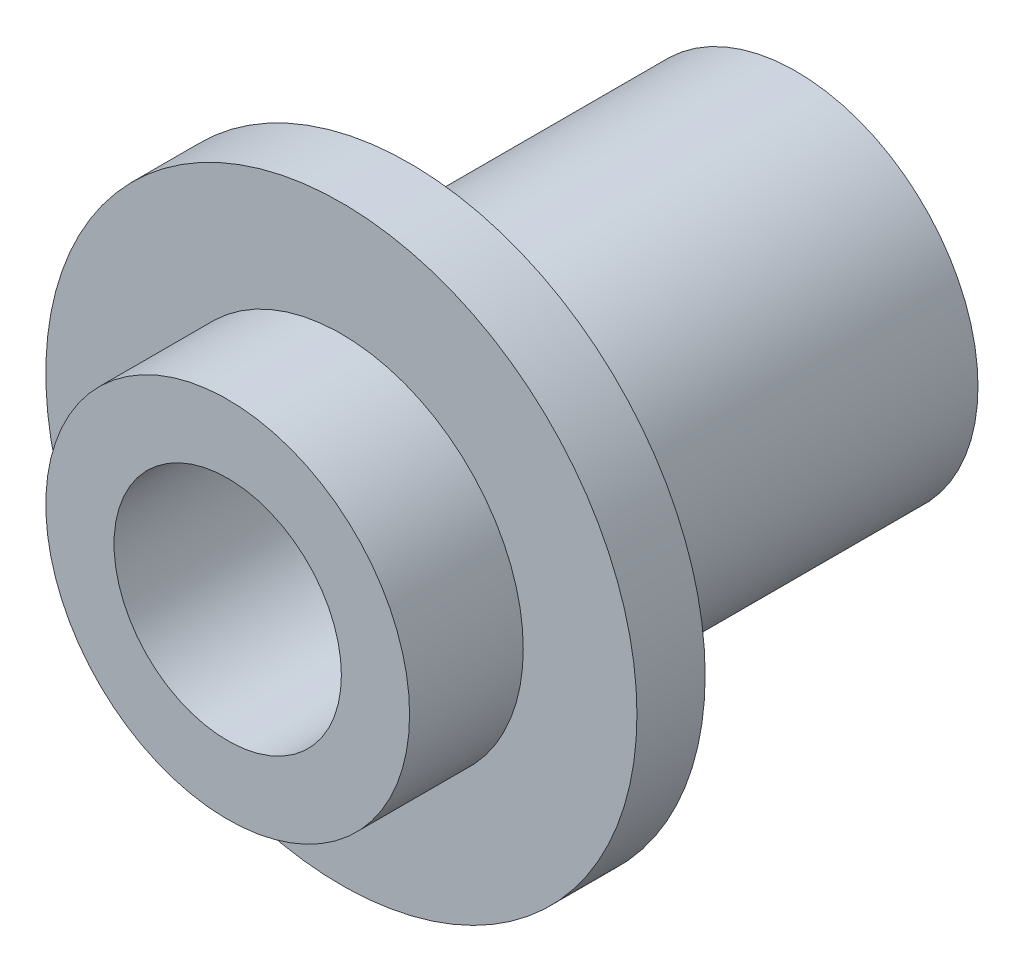
ISO-10303-21;
HEADER;
FILE_DESCRIPTION(('STEP AP214'),'2;1');
FILE_NAME('part.step','',(''),(''),'','','');
FILE_SCHEMA(('AUTOMOTIVE_DESIGN { 1 0 10303 214 1 1 1 1 }'));
ENDSEC;
DATA;
#1=APPLICATION_CONTEXT('core data for automotive mechanical design processes');
#2=APPLICATION_PROTOCOL_DEFINITION('international standard','automotive_design',2000,#1);
#3=PRODUCT_CONTEXT('',#1,'mechanical');
#4=PRODUCT('Part','Part','',(#3));
#5=PRODUCT_RELATED_PRODUCT_CATEGORY('part','',(#4));
#6=PRODUCT_DEFINITION_FORMATION('','',#4);
#7=PRODUCT_DEFINITION_CONTEXT('part definition',#1,'design');
#8=PRODUCT_DEFINITION('design','',#6,#7);
#9=PRODUCT_DEFINITION_SHAPE('','',#8);
#10=(LENGTH_UNIT() NAMED_UNIT(*) SI_UNIT(.MILLI.,.METRE.));
#11=(NAMED_UNIT(*) PLANE_ANGLE_UNIT() SI_UNIT($,.RADIAN.));
#12=(NAMED_UNIT(*) SI_UNIT($,.STERADIAN.) SOLID_ANGLE_UNIT());
#13=UNCERTAINTY_MEASURE_WITH_UNIT(LENGTH_MEASURE(1.E-05),#10,'distance_accuracy_value','');
#14=(GEOMETRIC_REPRESENTATION_CONTEXT(3) GLOBAL_UNCERTAINTY_ASSIGNED_CONTEXT((#13)) GLOBAL_UNIT_ASSIGNED_CONTEXT((#10,
#11,#12)) REPRESENTATION_CONTEXT('',''));
#15=CARTESIAN_POINT('',(0.,0.,0.));
#16=DIRECTION('',(0.,0.,1.));
#17=DIRECTION('',(1.,0.,0.));
#18=AXIS2_PLACEMENT_3D('',#15,#16,#17);
#19=CARTESIAN_POINT('',(0.,0.,30.));
#20=DIRECTION('',(0.,0.,1.));
#21=DIRECTION('',(1.,0.,0.));
#22=AXIS2_PLACEMENT_3D('',#19,#20,#21);
#23=CYLINDRICAL_SURFACE('',#22,5.);
#24=CARTESIAN_POINT('',(0.,0.,-20.));
#25=DIRECTION('',(0.,0.,1.));
#26=DIRECTION('',(1.,0.,0.));
#27=AXIS2_PLACEMENT_3D('',#24,#25,#26);
#28=CIRCLE('',#27,5.);
#29=CARTESIAN_POINT('',(5.,0.,-20.));
#30=VERTEX_POINT('',#29);
#31=EDGE_CURVE('E64',#30,#30,#28,.T.);
#32=ORIENTED_EDGE('',*,*,#31,.F.);
#33=EDGE_LOOP('',(#32));
#34=FACE_BOUND('',#33,.T.);
#35=CARTESIAN_POINT('',(0.,0.,5.));
#36=DIRECTION('',(0.,0.,1.));
#37=DIRECTION('',(1.,0.,0.));
#38=AXIS2_PLACEMENT_3D('',#35,#36,#37);
#39=CIRCLE('',#38,5.);
#40=CARTESIAN_POINT('',(5.,0.,5.));
#41=VERTEX_POINT('',#40);
#42=EDGE_CURVE('E10',#41,#41,#39,.T.);
#43=ORIENTED_EDGE('',*,*,#42,.T.);
#44=EDGE_LOOP('',(#43));
#45=FACE_BOUND('',#44,.T.);
#46=ADVANCED_FACE('F36',(#34,#45),#23,.F.);
#47=CARTESIAN_POINT('',(0.,5.,5.));
#48=DIRECTION('',(0.,0.,-1.));
#49=DIRECTION('',(-1.,0.,0.));
#50=AXIS2_PLACEMENT_3D('',#47,#48,#49);
#51=PLANE('',#50);
#52=ORIENTED_EDGE('',*,*,#42,.F.);
#53=EDGE_LOOP('',(#52));
#54=FACE_BOUND('',#53,.T.);
#55=CARTESIAN_POINT('',(0.,0.,5.));
#56=DIRECTION('',(0.,0.,1.));
#57=DIRECTION('',(1.,0.,0.));
#58=AXIS2_PLACEMENT_3D('',#55,#56,#57);
#59=CIRCLE('',#58,8.);
#60=CARTESIAN_POINT('',(8.,0.,5.));
#61=VERTEX_POINT('',#60);
#62=EDGE_CURVE('E42',#61,#61,#59,.T.);
#63=ORIENTED_EDGE('',*,*,#62,.T.);
#64=EDGE_LOOP('',(#63));
#65=FACE_BOUND('',#64,.T.);
#66=ADVANCED_FACE('F71',(#54,#65),#51,.F.);
#67=CARTESIAN_POINT('',(0.,0.,30.));
#68=DIRECTION('',(0.,0.,1.));
#69=DIRECTION('',(1.,0.,0.));
#70=AXIS2_PLACEMENT_3D('',#67,#68,#69);
#71=CYLINDRICAL_SURFACE('',#70,8.);
#72=ORIENTED_EDGE('',*,*,#62,.F.);
#73=EDGE_LOOP('',(#72));
#74=FACE_BOUND('',#73,.T.);
#75=CARTESIAN_POINT('',(0.,0.,0.));
#76=DIRECTION('',(0.,0.,1.));
#77=DIRECTION('',(1.,0.,0.));
#78=AXIS2_PLACEMENT_3D('',#75,#76,#77);
#79=CIRCLE('',#78,8.);
#80=CARTESIAN_POINT('',(8.,0.,0.));
#81=VERTEX_POINT('',#80);
#82=EDGE_CURVE('E46',#81,#81,#79,.T.);
#83=ORIENTED_EDGE('',*,*,#82,.T.);
#84=EDGE_LOOP('',(#83));
#85=FACE_BOUND('',#84,.T.);
#86=ADVANCED_FACE('F75',(#74,#85),#71,.T.);
#87=CARTESIAN_POINT('',(0.,8.,0.));
#88=DIRECTION('',(0.,0.,-1.));
#89=DIRECTION('',(-1.,0.,0.));
#90=AXIS2_PLACEMENT_3D('',#87,#88,#89);
#91=PLANE('',#90);
#92=ORIENTED_EDGE('',*,*,#82,.F.);
#93=EDGE_LOOP('',(#92));
#94=FACE_BOUND('',#93,.T.);
#95=CARTESIAN_POINT('',(0.,0.,0.));
#96=DIRECTION('',(0.,0.,1.));
#97=DIRECTION('',(1.,0.,0.));
#98=AXIS2_PLACEMENT_3D('',#95,#96,#97);
#99=CIRCLE('',#98,13.);
#100=CARTESIAN_POINT('',(13.,0.,0.));
#101=VERTEX_POINT('',#100);
#102=EDGE_CURVE('E50',#101,#101,#99,.T.);
#103=ORIENTED_EDGE('',*,*,#102,.T.);
#104=EDGE_LOOP('',(#103));
#105=FACE_BOUND('',#104,.T.);
#106=ADVANCED_FACE('F80',(#94,#105),#91,.F.);
#107=CARTESIAN_POINT('',(0.,0.,30.));
#108=DIRECTION('',(0.,0.,1.));
#109=DIRECTION('',(1.,0.,0.));
#110=AXIS2_PLACEMENT_3D('',#107,#108,#109);
#111=CYLINDRICAL_SURFACE('',#110,13.);
#112=ORIENTED_EDGE('',*,*,#102,.F.);
#113=EDGE_LOOP('',(#112));
#114=FACE_BOUND('',#113,.T.);
#115=CARTESIAN_POINT('',(0.,0.,-3.));
#116=DIRECTION('',(0.,0.,1.));
#117=DIRECTION('',(1.,0.,0.));
#118=AXIS2_PLACEMENT_3D('',#115,#116,#117);
#119=CIRCLE('',#118,13.);
#120=CARTESIAN_POINT('',(13.,0.,-3.));
#121=VERTEX_POINT('',#120);
#122=EDGE_CURVE('E55',#121,#121,#119,.T.);
#123=ORIENTED_EDGE('',*,*,#122,.T.);
#124=EDGE_LOOP('',(#123));
#125=FACE_BOUND('',#124,.T.);
#126=ADVANCED_FACE('F86',(#114,#125),#111,.T.);
#127=CARTESIAN_POINT('',(0.,13.,-3.));
#128=DIRECTION('',(0.,0.,1.));
#129=DIRECTION('',(1.,0.,0.));
#130=AXIS2_PLACEMENT_3D('',#127,#128,#129);
#131=PLANE('',#130);
#132=ORIENTED_EDGE('',*,*,#122,.F.);
#133=EDGE_LOOP('',(#132));
#134=FACE_BOUND('',#133,.T.);
#135=CARTESIAN_POINT('',(0.,0.,-3.));
#136=DIRECTION('',(0.,0.,1.));
#137=DIRECTION('',(1.,0.,0.));
#138=AXIS2_PLACEMENT_3D('',#135,#136,#137);
#139=CIRCLE('',#138,8.);
#140=CARTESIAN_POINT('',(8.,0.,-3.));
#141=VERTEX_POINT('',#140);
#142=EDGE_CURVE('E58',#141,#141,#139,.T.);
#143=ORIENTED_EDGE('',*,*,#142,.T.);
#144=EDGE_LOOP('',(#143));
#145=FACE_BOUND('',#144,.T.);
#146=ADVANCED_FACE('F90',(#134,#145),#131,.F.);
#147=CARTESIAN_POINT('',(0.,0.,30.));
#148=DIRECTION('',(0.,0.,1.));
#149=DIRECTION('',(1.,0.,0.));
#150=AXIS2_PLACEMENT_3D('',#147,#148,#149);
#151=CYLINDRICAL_SURFACE('',#150,8.);
#152=ORIENTED_EDGE('',*,*,#142,.F.);
#153=EDGE_LOOP('',(#152));
#154=FACE_BOUND('',#153,.T.);
#155=CARTESIAN_POINT('',(0.,0.,-20.));
#156=DIRECTION('',(0.,0.,1.));
#157=DIRECTION('',(1.,0.,0.));
#158=AXIS2_PLACEMENT_3D('',#155,#156,#157);
#159=CIRCLE('',#158,8.);
#160=CARTESIAN_POINT('',(8.,0.,-20.));
#161=VERTEX_POINT('',#160);
#162=EDGE_CURVE('E61',#161,#161,#159,.T.);
#163=ORIENTED_EDGE('',*,*,#162,.T.);
#164=EDGE_LOOP('',(#163));
#165=FACE_BOUND('',#164,.T.);
#166=ADVANCED_FACE('F94',(#154,#165),#151,.T.);
#167=CARTESIAN_POINT('',(0.,8.,-20.));
#168=DIRECTION('',(0.,0.,1.));
#169=DIRECTION('',(1.,0.,0.));
#170=AXIS2_PLACEMENT_3D('',#167,#168,#169);
#171=PLANE('',#170);
#172=ORIENTED_EDGE('',*,*,#162,.F.);
#173=EDGE_LOOP('',(#172));
#174=FACE_BOUND('',#173,.T.);
#175=ORIENTED_EDGE('',*,*,#31,.T.);
#176=EDGE_LOOP('',(#175));
#177=FACE_BOUND('',#176,.T.);
#178=ADVANCED_FACE('F68',(#174,#177),#171,.F.);
#179=CLOSED_SHELL('',(#46,#66,#86,#106,#126,#146,#166,#178));
#180=MANIFOLD_SOLID_BREP('B2',#179);
#181=ADVANCED_BREP_SHAPE_REPRESENTATION('',(#18,#180),#14);
#182=SHAPE_DEFINITION_REPRESENTATION(#9,#181);
ENDSEC;
END-ISO-10303-21;
